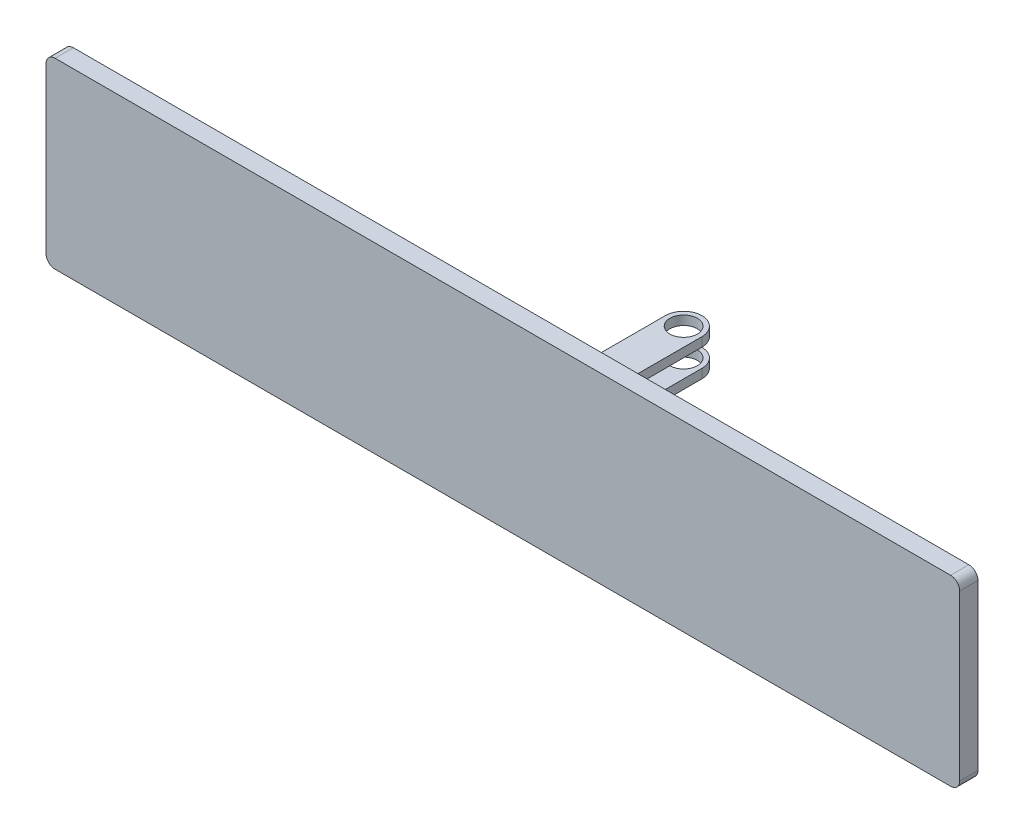
ISO-10303-21;
HEADER;
FILE_DESCRIPTION(('STEP AP214'),'2;1');
FILE_NAME('part.step','',(''),(''),'','','');
FILE_SCHEMA(('AUTOMOTIVE_DESIGN { 1 0 10303 214 1 1 1 1 }'));
ENDSEC;
DATA;
#1=APPLICATION_CONTEXT('core data for automotive mechanical design processes');
#2=APPLICATION_PROTOCOL_DEFINITION('international standard','automotive_design',2000,#1);
#3=PRODUCT_CONTEXT('',#1,'mechanical');
#4=PRODUCT('Part','Part','',(#3));
#5=PRODUCT_RELATED_PRODUCT_CATEGORY('part','',(#4));
#6=PRODUCT_DEFINITION_FORMATION('','',#4);
#7=PRODUCT_DEFINITION_CONTEXT('part definition',#1,'design');
#8=PRODUCT_DEFINITION('design','',#6,#7);
#9=PRODUCT_DEFINITION_SHAPE('','',#8);
#10=(LENGTH_UNIT() NAMED_UNIT(*) SI_UNIT(.MILLI.,.METRE.));
#11=(NAMED_UNIT(*) PLANE_ANGLE_UNIT() SI_UNIT($,.RADIAN.));
#12=(NAMED_UNIT(*) SI_UNIT($,.STERADIAN.) SOLID_ANGLE_UNIT());
#13=UNCERTAINTY_MEASURE_WITH_UNIT(LENGTH_MEASURE(1.E-05),#10,'distance_accuracy_value','');
#14=(GEOMETRIC_REPRESENTATION_CONTEXT(3) GLOBAL_UNCERTAINTY_ASSIGNED_CONTEXT((#13)) GLOBAL_UNIT_ASSIGNED_CONTEXT((#10,
#11,#12)) REPRESENTATION_CONTEXT('',''));
#15=CARTESIAN_POINT('',(0.,0.,0.));
#16=DIRECTION('',(0.,0.,1.));
#17=DIRECTION('',(1.,0.,0.));
#18=AXIS2_PLACEMENT_3D('',#15,#16,#17);
#19=CARTESIAN_POINT('',(0.,0.,0.));
#20=DIRECTION('',(0.,0.,1.));
#21=DIRECTION('',(1.,0.,0.));
#22=AXIS2_PLACEMENT_3D('',#19,#20,#21);
#23=PLANE('',#22);
#24=DIRECTION('',(0.,-1.,0.));
#25=VECTOR('',#24,1.);
#26=CARTESIAN_POINT('',(9.73097674118233,-4.24877108959848,0.));
#27=LINE('',#26,#25);
#28=CARTESIAN_POINT('',(9.73097674118233,-4.24877108959848,0.));
#29=VERTEX_POINT('',#28);
#30=CARTESIAN_POINT('',(9.73097674118233,-5.24877108959848,0.));
#31=VERTEX_POINT('',#30);
#32=EDGE_CURVE('E57',#29,#31,#27,.T.);
#33=ORIENTED_EDGE('',*,*,#32,.F.);
#34=DIRECTION('',(1.,0.,0.));
#35=VECTOR('',#34,1.);
#36=CARTESIAN_POINT('',(5.73097674118233,-4.24877108959848,0.));
#37=LINE('',#36,#35);
#38=CARTESIAN_POINT('',(5.73097674118233,-4.24877108959848,0.));
#39=VERTEX_POINT('',#38);
#40=EDGE_CURVE('E62',#39,#29,#37,.T.);
#41=ORIENTED_EDGE('',*,*,#40,.F.);
#42=DIRECTION('',(0.,-1.,0.));
#43=VECTOR('',#42,1.);
#44=CARTESIAN_POINT('',(5.73097674118233,-4.24877108959848,0.));
#45=LINE('',#44,#43);
#46=CARTESIAN_POINT('',(5.73097674118233,-5.24877108959848,0.));
#47=VERTEX_POINT('',#46);
#48=EDGE_CURVE('E178',#39,#47,#45,.T.);
#49=ORIENTED_EDGE('',*,*,#48,.T.);
#50=DIRECTION('',(1.,0.,0.));
#51=VECTOR('',#50,1.);
#52=CARTESIAN_POINT('',(5.73097674118233,-5.24877108959848,0.));
#53=LINE('',#52,#51);
#54=EDGE_CURVE('E182',#47,#31,#53,.T.);
#55=ORIENTED_EDGE('',*,*,#54,.T.);
#56=EDGE_LOOP('',(#33,#41,#49,#55));
#57=FACE_BOUND('',#56,.T.);
#58=DIRECTION('',(1.,0.,0.));
#59=VECTOR('',#58,1.);
#60=CARTESIAN_POINT('',(-45.0489881106832,3.75122891040152,0.));
#61=LINE('',#60,#59);
#62=CARTESIAN_POINT('',(-44.0489881106832,3.75122891040152,0.));
#63=VERTEX_POINT('',#62);
#64=CARTESIAN_POINT('',(53.9510118893168,3.75122891040152,0.));
#65=VERTEX_POINT('',#64);
#66=EDGE_CURVE('E250',#63,#65,#61,.T.);
#67=ORIENTED_EDGE('',*,*,#66,.T.);
#68=CARTESIAN_POINT('',(53.9510118893168,2.75122891040152,0.));
#69=DIRECTION('',(0.,0.,1.));
#70=DIRECTION('',(1.,0.,0.));
#71=AXIS2_PLACEMENT_3D('',#68,#69,#70);
#72=CIRCLE('',#71,1.);
#73=CARTESIAN_POINT('',(54.9510118893168,2.75122891040152,0.));
#74=VERTEX_POINT('',#73);
#75=EDGE_CURVE('E11',#65,#74,#72,.F.);
#76=ORIENTED_EDGE('',*,*,#75,.T.);
#77=DIRECTION('',(0.,-1.,0.));
#78=VECTOR('',#77,1.);
#79=CARTESIAN_POINT('',(54.9510118893168,3.75122891040152,0.));
#80=LINE('',#79,#78);
#81=CARTESIAN_POINT('',(54.9510118893168,-15.2487710895985,0.));
#82=VERTEX_POINT('',#81);
#83=EDGE_CURVE('E266',#74,#82,#80,.T.);
#84=ORIENTED_EDGE('',*,*,#83,.T.);
#85=CARTESIAN_POINT('',(53.9510118893168,-15.2487710895985,0.));
#86=DIRECTION('',(0.,0.,1.));
#87=DIRECTION('',(1.,0.,0.));
#88=AXIS2_PLACEMENT_3D('',#85,#86,#87);
#89=CIRCLE('',#88,1.);
#90=CARTESIAN_POINT('',(53.9510118893168,-16.2487710895985,0.));
#91=VERTEX_POINT('',#90);
#92=EDGE_CURVE('E283',#82,#91,#89,.F.);
#93=ORIENTED_EDGE('',*,*,#92,.T.);
#94=DIRECTION('',(1.,0.,0.));
#95=VECTOR('',#94,1.);
#96=CARTESIAN_POINT('',(-45.0489881106832,-16.2487710895985,0.));
#97=LINE('',#96,#95);
#98=CARTESIAN_POINT('',(-44.0489881106832,-16.2487710895985,0.));
#99=VERTEX_POINT('',#98);
#100=EDGE_CURVE('E263',#99,#91,#97,.T.);
#101=ORIENTED_EDGE('',*,*,#100,.F.);
#102=CARTESIAN_POINT('',(-44.0489881106832,-15.2487710895985,0.));
#103=DIRECTION('',(0.,0.,1.));
#104=DIRECTION('',(1.,0.,0.));
#105=AXIS2_PLACEMENT_3D('',#102,#103,#104);
#106=CIRCLE('',#105,1.);
#107=CARTESIAN_POINT('',(-45.0489881106832,-15.2487710895985,0.));
#108=VERTEX_POINT('',#107);
#109=EDGE_CURVE('E295',#99,#108,#106,.F.);
#110=ORIENTED_EDGE('',*,*,#109,.T.);
#111=DIRECTION('',(0.,-1.,0.));
#112=VECTOR('',#111,1.);
#113=CARTESIAN_POINT('',(-45.0489881106832,3.75122891040152,0.));
#114=LINE('',#113,#112);
#115=CARTESIAN_POINT('',(-45.0489881106832,2.75122891040152,0.));
#116=VERTEX_POINT('',#115);
#117=EDGE_CURVE('E245',#116,#108,#114,.T.);
#118=ORIENTED_EDGE('',*,*,#117,.F.);
#119=CARTESIAN_POINT('',(-44.0489881106832,2.75122891040152,0.));
#120=DIRECTION('',(0.,0.,1.));
#121=DIRECTION('',(1.,0.,0.));
#122=AXIS2_PLACEMENT_3D('',#119,#120,#121);
#123=CIRCLE('',#122,1.);
#124=EDGE_CURVE('E310',#116,#63,#123,.F.);
#125=ORIENTED_EDGE('',*,*,#124,.T.);
#126=EDGE_LOOP('',(#67,#76,#84,#93,#101,#110,#118,#125));
#127=FACE_BOUND('',#126,.T.);
#128=DIRECTION('',(-1.,0.,0.));
#129=VECTOR('',#128,1.);
#130=CARTESIAN_POINT('',(9.73097674118233,-8.24877108959848,0.));
#131=LINE('',#130,#129);
#132=CARTESIAN_POINT('',(9.73097674118233,-8.24877108959848,0.));
#133=VERTEX_POINT('',#132);
#134=CARTESIAN_POINT('',(5.73097674118233,-8.24877108959848,0.));
#135=VERTEX_POINT('',#134);
#136=EDGE_CURVE('E202',#133,#135,#131,.T.);
#137=ORIENTED_EDGE('',*,*,#136,.F.);
#138=DIRECTION('',(0.,1.,0.));
#139=VECTOR('',#138,1.);
#140=CARTESIAN_POINT('',(9.73097674118233,-8.24877108959848,0.));
#141=LINE('',#140,#139);
#142=CARTESIAN_POINT('',(9.73097674118233,-7.24877108959848,0.));
#143=VERTEX_POINT('',#142);
#144=EDGE_CURVE('E218',#133,#143,#141,.T.);
#145=ORIENTED_EDGE('',*,*,#144,.T.);
#146=DIRECTION('',(-1.,0.,0.));
#147=VECTOR('',#146,1.);
#148=CARTESIAN_POINT('',(9.73097674118233,-7.24877108959848,0.));
#149=LINE('',#148,#147);
#150=CARTESIAN_POINT('',(5.73097674118233,-7.24877108959848,0.));
#151=VERTEX_POINT('',#150);
#152=EDGE_CURVE('E201',#143,#151,#149,.T.);
#153=ORIENTED_EDGE('',*,*,#152,.T.);
#154=DIRECTION('',(0.,1.,0.));
#155=VECTOR('',#154,1.);
#156=CARTESIAN_POINT('',(5.73097674118233,-8.24877108959848,0.));
#157=LINE('',#156,#155);
#158=EDGE_CURVE('E242',#135,#151,#157,.T.);
#159=ORIENTED_EDGE('',*,*,#158,.F.);
#160=EDGE_LOOP('',(#137,#145,#153,#159));
#161=FACE_BOUND('',#160,.T.);
#162=ADVANCED_FACE('F39',(#57,#127,#161),#23,.F.);
#163=CARTESIAN_POINT('',(53.9510118893168,2.75122891040152,2.));
#164=DIRECTION('',(0.,0.,-1.));
#165=DIRECTION('',(-1.,0.,0.));
#166=AXIS2_PLACEMENT_3D('',#163,#164,#165);
#167=CYLINDRICAL_SURFACE('',#166,1.);
#168=DIRECTION('',(0.,0.,-1.));
#169=VECTOR('',#168,1.);
#170=CARTESIAN_POINT('',(53.9510118893168,3.75122891040152,2.));
#171=LINE('',#170,#169);
#172=CARTESIAN_POINT('',(53.9510118893168,3.75122891040152,2.));
#173=VERTEX_POINT('',#172);
#174=EDGE_CURVE('E316',#173,#65,#171,.T.);
#175=ORIENTED_EDGE('',*,*,#174,.F.);
#176=CARTESIAN_POINT('',(53.9510118893168,2.75122891040152,2.));
#177=DIRECTION('',(0.,0.,1.));
#178=DIRECTION('',(1.,0.,0.));
#179=AXIS2_PLACEMENT_3D('',#176,#177,#178);
#180=CIRCLE('',#179,1.);
#181=CARTESIAN_POINT('',(54.9510118893168,2.75122891040152,2.));
#182=VERTEX_POINT('',#181);
#183=EDGE_CURVE('E49',#182,#173,#180,.T.);
#184=ORIENTED_EDGE('',*,*,#183,.F.);
#185=DIRECTION('',(0.,0.,-1.));
#186=VECTOR('',#185,1.);
#187=CARTESIAN_POINT('',(54.9510118893168,2.75122891040152,2.));
#188=LINE('',#187,#186);
#189=EDGE_CURVE('E320',#74,#182,#188,.F.);
#190=ORIENTED_EDGE('',*,*,#189,.F.);
#191=ORIENTED_EDGE('',*,*,#75,.F.);
#192=EDGE_LOOP('',(#175,#184,#190,#191));
#193=FACE_BOUND('',#192,.T.);
#194=ADVANCED_FACE('F41',(#193),#167,.T.);
#195=CARTESIAN_POINT('',(-44.0489881106832,2.75122891040152,2.));
#196=DIRECTION('',(0.,0.,-1.));
#197=DIRECTION('',(-1.,0.,0.));
#198=AXIS2_PLACEMENT_3D('',#195,#196,#197);
#199=CYLINDRICAL_SURFACE('',#198,1.);
#200=DIRECTION('',(0.,0.,1.));
#201=VECTOR('',#200,1.);
#202=CARTESIAN_POINT('',(-44.0489881106832,3.75122891040152,2.));
#203=LINE('',#202,#201);
#204=CARTESIAN_POINT('',(-44.0489881106832,3.75122891040152,2.));
#205=VERTEX_POINT('',#204);
#206=EDGE_CURVE('E302',#63,#205,#203,.T.);
#207=ORIENTED_EDGE('',*,*,#206,.F.);
#208=ORIENTED_EDGE('',*,*,#124,.F.);
#209=DIRECTION('',(0.,0.,1.));
#210=VECTOR('',#209,1.);
#211=CARTESIAN_POINT('',(-45.0489881106832,2.75122891040152,2.));
#212=LINE('',#211,#210);
#213=CARTESIAN_POINT('',(-45.0489881106832,2.75122891040152,2.));
#214=VERTEX_POINT('',#213);
#215=EDGE_CURVE('E306',#214,#116,#212,.F.);
#216=ORIENTED_EDGE('',*,*,#215,.F.);
#217=CARTESIAN_POINT('',(-44.0489881106832,2.75122891040152,2.));
#218=DIRECTION('',(0.,0.,1.));
#219=DIRECTION('',(1.,0.,0.));
#220=AXIS2_PLACEMENT_3D('',#217,#218,#219);
#221=CIRCLE('',#220,1.);
#222=EDGE_CURVE('E313',#205,#214,#221,.T.);
#223=ORIENTED_EDGE('',*,*,#222,.F.);
#224=EDGE_LOOP('',(#207,#208,#216,#223));
#225=FACE_BOUND('',#224,.T.);
#226=ADVANCED_FACE('F382',(#225),#199,.T.);
#227=CARTESIAN_POINT('',(-44.0489881106832,-15.2487710895985,2.));
#228=DIRECTION('',(0.,0.,1.));
#229=DIRECTION('',(1.,0.,0.));
#230=AXIS2_PLACEMENT_3D('',#227,#228,#229);
#231=CYLINDRICAL_SURFACE('',#230,1.);
#232=DIRECTION('',(0.,0.,1.));
#233=VECTOR('',#232,1.);
#234=CARTESIAN_POINT('',(-45.0489881106832,-15.2487710895985,2.));
#235=LINE('',#234,#233);
#236=CARTESIAN_POINT('',(-45.0489881106832,-15.2487710895985,2.));
#237=VERTEX_POINT('',#236);
#238=EDGE_CURVE('E287',#108,#237,#235,.T.);
#239=ORIENTED_EDGE('',*,*,#238,.F.);
#240=ORIENTED_EDGE('',*,*,#109,.F.);
#241=DIRECTION('',(0.,0.,1.));
#242=VECTOR('',#241,1.);
#243=CARTESIAN_POINT('',(-44.0489881106832,-16.2487710895985,2.));
#244=LINE('',#243,#242);
#245=CARTESIAN_POINT('',(-44.0489881106832,-16.2487710895985,2.));
#246=VERTEX_POINT('',#245);
#247=EDGE_CURVE('E291',#246,#99,#244,.F.);
#248=ORIENTED_EDGE('',*,*,#247,.F.);
#249=CARTESIAN_POINT('',(-44.0489881106832,-15.2487710895985,2.));
#250=DIRECTION('',(0.,0.,1.));
#251=DIRECTION('',(1.,0.,0.));
#252=AXIS2_PLACEMENT_3D('',#249,#250,#251);
#253=CIRCLE('',#252,1.);
#254=EDGE_CURVE('E299',#237,#246,#253,.T.);
#255=ORIENTED_EDGE('',*,*,#254,.F.);
#256=EDGE_LOOP('',(#239,#240,#248,#255));
#257=FACE_BOUND('',#256,.T.);
#258=ADVANCED_FACE('F408',(#257),#231,.T.);
#259=CARTESIAN_POINT('',(53.9510118893168,-15.2487710895985,2.));
#260=DIRECTION('',(0.,0.,1.));
#261=DIRECTION('',(1.,0.,0.));
#262=AXIS2_PLACEMENT_3D('',#259,#260,#261);
#263=CYLINDRICAL_SURFACE('',#262,1.);
#264=DIRECTION('',(0.,0.,-1.));
#265=VECTOR('',#264,1.);
#266=CARTESIAN_POINT('',(54.9510118893168,-15.2487710895985,2.));
#267=LINE('',#266,#265);
#268=CARTESIAN_POINT('',(54.9510118893168,-15.2487710895985,2.));
#269=VERTEX_POINT('',#268);
#270=EDGE_CURVE('E260',#269,#82,#267,.T.);
#271=ORIENTED_EDGE('',*,*,#270,.F.);
#272=CARTESIAN_POINT('',(53.9510118893168,-15.2487710895985,2.));
#273=DIRECTION('',(0.,0.,1.));
#274=DIRECTION('',(1.,0.,0.));
#275=AXIS2_PLACEMENT_3D('',#272,#273,#274);
#276=CIRCLE('',#275,1.);
#277=CARTESIAN_POINT('',(53.9510118893168,-16.2487710895985,2.));
#278=VERTEX_POINT('',#277);
#279=EDGE_CURVE('E279',#278,#269,#276,.T.);
#280=ORIENTED_EDGE('',*,*,#279,.F.);
#281=DIRECTION('',(0.,0.,-1.));
#282=VECTOR('',#281,1.);
#283=CARTESIAN_POINT('',(53.9510118893168,-16.2487710895985,2.));
#284=LINE('',#283,#282);
#285=EDGE_CURVE('E275',#91,#278,#284,.F.);
#286=ORIENTED_EDGE('',*,*,#285,.F.);
#287=ORIENTED_EDGE('',*,*,#92,.F.);
#288=EDGE_LOOP('',(#271,#280,#286,#287));
#289=FACE_BOUND('',#288,.T.);
#290=ADVANCED_FACE('F404',(#289),#263,.T.);
#291=CARTESIAN_POINT('',(-45.0489881106832,3.75122891040152,2.));
#292=DIRECTION('',(1.,0.,0.));
#293=DIRECTION('',(0.,0.,-1.));
#294=AXIS2_PLACEMENT_3D('',#291,#292,#293);
#295=PLANE('',#294);
#296=DIRECTION('',(0.,-1.,0.));
#297=VECTOR('',#296,1.);
#298=CARTESIAN_POINT('',(-45.0489881106832,3.75122891040152,2.));
#299=LINE('',#298,#297);
#300=EDGE_CURVE('E246',#214,#237,#299,.T.);
#301=ORIENTED_EDGE('',*,*,#300,.F.);
#302=ORIENTED_EDGE('',*,*,#215,.T.);
#303=ORIENTED_EDGE('',*,*,#117,.T.);
#304=ORIENTED_EDGE('',*,*,#238,.T.);
#305=EDGE_LOOP('',(#301,#302,#303,#304));
#306=FACE_BOUND('',#305,.T.);
#307=ADVANCED_FACE('F400',(#306),#295,.F.);
#308=CARTESIAN_POINT('',(-45.0489881106832,-16.2487710895985,2.));
#309=DIRECTION('',(0.,1.,0.));
#310=DIRECTION('',(0.,0.,1.));
#311=AXIS2_PLACEMENT_3D('',#308,#309,#310);
#312=PLANE('',#311);
#313=DIRECTION('',(1.,0.,0.));
#314=VECTOR('',#313,1.);
#315=CARTESIAN_POINT('',(-45.0489881106832,-16.2487710895985,2.));
#316=LINE('',#315,#314);
#317=EDGE_CURVE('E249',#246,#278,#316,.T.);
#318=ORIENTED_EDGE('',*,*,#317,.F.);
#319=ORIENTED_EDGE('',*,*,#247,.T.);
#320=ORIENTED_EDGE('',*,*,#100,.T.);
#321=ORIENTED_EDGE('',*,*,#285,.T.);
#322=EDGE_LOOP('',(#318,#319,#320,#321));
#323=FACE_BOUND('',#322,.T.);
#324=ADVANCED_FACE('F396',(#323),#312,.F.);
#325=CARTESIAN_POINT('',(54.9510118893168,3.75122891040152,2.));
#326=DIRECTION('',(1.,0.,0.));
#327=DIRECTION('',(0.,0.,-1.));
#328=AXIS2_PLACEMENT_3D('',#325,#326,#327);
#329=PLANE('',#328);
#330=ORIENTED_EDGE('',*,*,#83,.F.);
#331=ORIENTED_EDGE('',*,*,#189,.T.);
#332=DIRECTION('',(0.,-1.,0.));
#333=VECTOR('',#332,1.);
#334=CARTESIAN_POINT('',(54.9510118893168,3.75122891040152,2.));
#335=LINE('',#334,#333);
#336=EDGE_CURVE('E253',#182,#269,#335,.T.);
#337=ORIENTED_EDGE('',*,*,#336,.T.);
#338=ORIENTED_EDGE('',*,*,#270,.T.);
#339=EDGE_LOOP('',(#330,#331,#337,#338));
#340=FACE_BOUND('',#339,.T.);
#341=ADVANCED_FACE('F392',(#340),#329,.T.);
#342=CARTESIAN_POINT('',(-45.0489881106832,3.75122891040152,2.));
#343=DIRECTION('',(0.,1.,0.));
#344=DIRECTION('',(0.,0.,1.));
#345=AXIS2_PLACEMENT_3D('',#342,#343,#344);
#346=PLANE('',#345);
#347=DIRECTION('',(1.,0.,0.));
#348=VECTOR('',#347,1.);
#349=CARTESIAN_POINT('',(-45.0489881106832,3.75122891040152,2.));
#350=LINE('',#349,#348);
#351=EDGE_CURVE('E256',#205,#173,#350,.T.);
#352=ORIENTED_EDGE('',*,*,#351,.T.);
#353=ORIENTED_EDGE('',*,*,#174,.T.);
#354=ORIENTED_EDGE('',*,*,#66,.F.);
#355=ORIENTED_EDGE('',*,*,#206,.T.);
#356=EDGE_LOOP('',(#352,#353,#354,#355));
#357=FACE_BOUND('',#356,.T.);
#358=ADVANCED_FACE('F389',(#357),#346,.T.);
#359=CARTESIAN_POINT('',(0.,0.,2.));
#360=DIRECTION('',(0.,0.,1.));
#361=DIRECTION('',(1.,0.,0.));
#362=AXIS2_PLACEMENT_3D('',#359,#360,#361);
#363=PLANE('',#362);
#364=ORIENTED_EDGE('',*,*,#336,.F.);
#365=ORIENTED_EDGE('',*,*,#183,.T.);
#366=ORIENTED_EDGE('',*,*,#351,.F.);
#367=ORIENTED_EDGE('',*,*,#222,.T.);
#368=ORIENTED_EDGE('',*,*,#300,.T.);
#369=ORIENTED_EDGE('',*,*,#254,.T.);
#370=ORIENTED_EDGE('',*,*,#317,.T.);
#371=ORIENTED_EDGE('',*,*,#279,.T.);
#372=EDGE_LOOP('',(#364,#365,#366,#367,#368,#369,#370,#371));
#373=FACE_BOUND('',#372,.T.);
#374=ADVANCED_FACE('F387',(#373),#363,.T.);
#375=CARTESIAN_POINT('',(5.73097674118233,-8.24877108959848,0.));
#376=DIRECTION('',(1.,0.,0.));
#377=DIRECTION('',(0.,0.,-1.));
#378=AXIS2_PLACEMENT_3D('',#375,#376,#377);
#379=PLANE('',#378);
#380=DIRECTION('',(0.,0.,-1.));
#381=VECTOR('',#380,1.);
#382=CARTESIAN_POINT('',(5.73097674118233,-7.24877108959848,0.));
#383=LINE('',#382,#381);
#384=CARTESIAN_POINT('',(5.73097674118233,-7.24877108959848,-15.));
#385=VERTEX_POINT('',#384);
#386=EDGE_CURVE('E222',#151,#385,#383,.T.);
#387=ORIENTED_EDGE('',*,*,#386,.T.);
#388=DIRECTION('',(0.,1.,0.));
#389=VECTOR('',#388,1.);
#390=CARTESIAN_POINT('',(5.73097674118233,-8.24877108959848,-15.));
#391=LINE('',#390,#389);
#392=CARTESIAN_POINT('',(5.73097674118233,-8.24877108959848,-15.));
#393=VERTEX_POINT('',#392);
#394=EDGE_CURVE('E239',#393,#385,#391,.T.);
#395=ORIENTED_EDGE('',*,*,#394,.F.);
#396=DIRECTION('',(0.,0.,-1.));
#397=VECTOR('',#396,1.);
#398=CARTESIAN_POINT('',(5.73097674118233,-8.24877108959848,0.));
#399=LINE('',#398,#397);
#400=EDGE_CURVE('E206',#135,#393,#399,.T.);
#401=ORIENTED_EDGE('',*,*,#400,.F.);
#402=ORIENTED_EDGE('',*,*,#158,.T.);
#403=EDGE_LOOP('',(#387,#395,#401,#402));
#404=FACE_BOUND('',#403,.T.);
#405=ADVANCED_FACE('F438',(#404),#379,.F.);
#406=CARTESIAN_POINT('',(7.73097674118233,-8.24877108959848,-15.));
#407=DIRECTION('',(0.,1.,0.));
#408=DIRECTION('',(0.,0.,1.));
#409=AXIS2_PLACEMENT_3D('',#406,#407,#408);
#410=CYLINDRICAL_SURFACE('',#409,2.);
#411=CARTESIAN_POINT('',(7.73097674118233,-7.24877108959848,-15.));
#412=DIRECTION('',(0.,1.,0.));
#413=DIRECTION('',(0.,0.,1.));
#414=AXIS2_PLACEMENT_3D('',#411,#412,#413);
#415=CIRCLE('',#414,2.);
#416=CARTESIAN_POINT('',(9.73097674118233,-7.24877108959848,-15.));
#417=VERTEX_POINT('',#416);
#418=EDGE_CURVE('E226',#417,#385,#415,.T.);
#419=ORIENTED_EDGE('',*,*,#418,.F.);
#420=DIRECTION('',(0.,1.,0.));
#421=VECTOR('',#420,1.);
#422=CARTESIAN_POINT('',(9.73097674118233,-8.24877108959848,-15.));
#423=LINE('',#422,#421);
#424=CARTESIAN_POINT('',(9.73097674118233,-8.24877108959848,-15.));
#425=VERTEX_POINT('',#424);
#426=EDGE_CURVE('E236',#425,#417,#423,.T.);
#427=ORIENTED_EDGE('',*,*,#426,.F.);
#428=CARTESIAN_POINT('',(7.73097674118233,-8.24877108959848,-15.));
#429=DIRECTION('',(0.,1.,0.));
#430=DIRECTION('',(0.,0.,1.));
#431=AXIS2_PLACEMENT_3D('',#428,#429,#430);
#432=CIRCLE('',#431,2.);
#433=EDGE_CURVE('E210',#425,#393,#432,.T.);
#434=ORIENTED_EDGE('',*,*,#433,.T.);
#435=ORIENTED_EDGE('',*,*,#394,.T.);
#436=EDGE_LOOP('',(#419,#427,#434,#435));
#437=FACE_BOUND('',#436,.T.);
#438=ADVANCED_FACE('F442',(#437),#410,.T.);
#439=CARTESIAN_POINT('',(9.73097674118233,-8.24877108959848,0.));
#440=DIRECTION('',(1.,0.,0.));
#441=DIRECTION('',(0.,0.,-1.));
#442=AXIS2_PLACEMENT_3D('',#439,#440,#441);
#443=PLANE('',#442);
#444=DIRECTION('',(0.,0.,-1.));
#445=VECTOR('',#444,1.);
#446=CARTESIAN_POINT('',(9.73097674118233,-7.24877108959848,0.));
#447=LINE('',#446,#445);
#448=EDGE_CURVE('E207',#143,#417,#447,.T.);
#449=ORIENTED_EDGE('',*,*,#448,.F.);
#450=ORIENTED_EDGE('',*,*,#144,.F.);
#451=DIRECTION('',(0.,0.,-1.));
#452=VECTOR('',#451,1.);
#453=CARTESIAN_POINT('',(9.73097674118233,-8.24877108959848,0.));
#454=LINE('',#453,#452);
#455=EDGE_CURVE('E214',#133,#425,#454,.T.);
#456=ORIENTED_EDGE('',*,*,#455,.T.);
#457=ORIENTED_EDGE('',*,*,#426,.T.);
#458=EDGE_LOOP('',(#449,#450,#456,#457));
#459=FACE_BOUND('',#458,.T.);
#460=ADVANCED_FACE('F447',(#459),#443,.T.);
#461=CARTESIAN_POINT('',(7.73097674118233,-8.24877108959848,-15.));
#462=DIRECTION('',(0.,1.,0.));
#463=DIRECTION('',(0.,0.,1.));
#464=AXIS2_PLACEMENT_3D('',#461,#462,#463);
#465=PLANE('',#464);
#466=CARTESIAN_POINT('',(7.73097674118233,-8.24877108959848,-15.));
#467=DIRECTION('',(0.,1.,0.));
#468=DIRECTION('',(0.,0.,1.));
#469=AXIS2_PLACEMENT_3D('',#466,#467,#468);
#470=CIRCLE('',#469,1.5);
#471=CARTESIAN_POINT('',(7.73097674118233,-8.24877108959848,-13.5));
#472=VERTEX_POINT('',#471);
#473=EDGE_CURVE('E185',#472,#472,#470,.T.);
#474=ORIENTED_EDGE('',*,*,#473,.T.);
#475=EDGE_LOOP('',(#474));
#476=FACE_BOUND('',#475,.T.);
#477=CARTESIAN_POINT('',(7.73097674118233,-8.24877108959848,-5.));
#478=DIRECTION('',(0.,1.,0.));
#479=DIRECTION('',(0.,0.,1.));
#480=AXIS2_PLACEMENT_3D('',#477,#478,#479);
#481=CIRCLE('',#480,1.5);
#482=CARTESIAN_POINT('',(7.73097674118233,-8.24877108959848,-3.5));
#483=VERTEX_POINT('',#482);
#484=EDGE_CURVE('E335',#483,#483,#481,.T.);
#485=ORIENTED_EDGE('',*,*,#484,.T.);
#486=EDGE_LOOP('',(#485));
#487=FACE_BOUND('',#486,.T.);
#488=ORIENTED_EDGE('',*,*,#136,.T.);
#489=ORIENTED_EDGE('',*,*,#400,.T.);
#490=ORIENTED_EDGE('',*,*,#433,.F.);
#491=ORIENTED_EDGE('',*,*,#455,.F.);
#492=EDGE_LOOP('',(#488,#489,#490,#491));
#493=FACE_BOUND('',#492,.T.);
#494=ADVANCED_FACE('F453',(#476,#487,#493),#465,.F.);
#495=CARTESIAN_POINT('',(7.73097674118233,-7.24877108959848,-15.));
#496=DIRECTION('',(0.,1.,0.));
#497=DIRECTION('',(0.,0.,1.));
#498=AXIS2_PLACEMENT_3D('',#495,#496,#497);
#499=PLANE('',#498);
#500=CARTESIAN_POINT('',(7.73097674118233,-7.24877108959848,-15.));
#501=DIRECTION('',(0.,1.,0.));
#502=DIRECTION('',(0.,0.,1.));
#503=AXIS2_PLACEMENT_3D('',#500,#501,#502);
#504=CIRCLE('',#503,1.5);
#505=CARTESIAN_POINT('',(7.73097674118233,-7.24877108959848,-13.5));
#506=VERTEX_POINT('',#505);
#507=EDGE_CURVE('E349',#506,#506,#504,.T.);
#508=ORIENTED_EDGE('',*,*,#507,.F.);
#509=EDGE_LOOP('',(#508));
#510=FACE_BOUND('',#509,.T.);
#511=CARTESIAN_POINT('',(7.73097674118233,-7.24877108959848,-5.));
#512=DIRECTION('',(0.,1.,0.));
#513=DIRECTION('',(0.,0.,1.));
#514=AXIS2_PLACEMENT_3D('',#511,#512,#513);
#515=CIRCLE('',#514,1.5);
#516=CARTESIAN_POINT('',(7.73097674118233,-7.24877108959848,-3.5));
#517=VERTEX_POINT('',#516);
#518=EDGE_CURVE('E328',#517,#517,#515,.T.);
#519=ORIENTED_EDGE('',*,*,#518,.F.);
#520=EDGE_LOOP('',(#519));
#521=FACE_BOUND('',#520,.T.);
#522=ORIENTED_EDGE('',*,*,#152,.F.);
#523=ORIENTED_EDGE('',*,*,#448,.T.);
#524=ORIENTED_EDGE('',*,*,#418,.T.);
#525=ORIENTED_EDGE('',*,*,#386,.F.);
#526=EDGE_LOOP('',(#522,#523,#524,#525));
#527=FACE_BOUND('',#526,.T.);
#528=ADVANCED_FACE('F455',(#510,#521,#527),#499,.T.);
#529=CARTESIAN_POINT('',(9.73097674118233,-4.24877108959848,0.));
#530=DIRECTION('',(-1.,0.,0.));
#531=DIRECTION('',(0.,0.,1.));
#532=AXIS2_PLACEMENT_3D('',#529,#530,#531);
#533=PLANE('',#532);
#534=DIRECTION('',(0.,0.,-1.));
#535=VECTOR('',#534,1.);
#536=CARTESIAN_POINT('',(9.73097674118233,-5.24877108959848,0.));
#537=LINE('',#536,#535);
#538=CARTESIAN_POINT('',(9.73097674118233,-5.24877108959848,-15.));
#539=VERTEX_POINT('',#538);
#540=EDGE_CURVE('E165',#31,#539,#537,.T.);
#541=ORIENTED_EDGE('',*,*,#540,.T.);
#542=DIRECTION('',(0.,-1.,0.));
#543=VECTOR('',#542,1.);
#544=CARTESIAN_POINT('',(9.73097674118233,-4.24877108959848,-15.));
#545=LINE('',#544,#543);
#546=CARTESIAN_POINT('',(9.73097674118233,-4.24877108959848,-15.));
#547=VERTEX_POINT('',#546);
#548=EDGE_CURVE('E162',#547,#539,#545,.T.);
#549=ORIENTED_EDGE('',*,*,#548,.F.);
#550=DIRECTION('',(0.,0.,-1.));
#551=VECTOR('',#550,1.);
#552=CARTESIAN_POINT('',(9.73097674118233,-4.24877108959848,0.));
#553=LINE('',#552,#551);
#554=EDGE_CURVE('E151',#29,#547,#553,.T.);
#555=ORIENTED_EDGE('',*,*,#554,.F.);
#556=ORIENTED_EDGE('',*,*,#32,.T.);
#557=EDGE_LOOP('',(#541,#549,#555,#556));
#558=FACE_BOUND('',#557,.T.);
#559=ADVANCED_FACE('F163',(#558),#533,.F.);
#560=CARTESIAN_POINT('',(7.73097674118233,-4.24877108959848,-15.));
#561=DIRECTION('',(0.,-1.,0.));
#562=DIRECTION('',(0.,0.,-1.));
#563=AXIS2_PLACEMENT_3D('',#560,#561,#562);
#564=CYLINDRICAL_SURFACE('',#563,2.);
#565=CARTESIAN_POINT('',(7.73097674118233,-5.24877108959848,-15.));
#566=DIRECTION('',(0.,1.,0.));
#567=DIRECTION('',(0.,0.,1.));
#568=AXIS2_PLACEMENT_3D('',#565,#566,#567);
#569=CIRCLE('',#568,2.);
#570=CARTESIAN_POINT('',(5.73097674118233,-5.24877108959848,-15.));
#571=VERTEX_POINT('',#570);
#572=EDGE_CURVE('E188',#539,#571,#569,.T.);
#573=ORIENTED_EDGE('',*,*,#572,.T.);
#574=DIRECTION('',(0.,-1.,0.));
#575=VECTOR('',#574,1.);
#576=CARTESIAN_POINT('',(5.73097674118233,-4.24877108959848,-15.));
#577=LINE('',#576,#575);
#578=CARTESIAN_POINT('',(5.73097674118233,-4.24877108959848,-15.));
#579=VERTEX_POINT('',#578);
#580=EDGE_CURVE('E170',#579,#571,#577,.T.);
#581=ORIENTED_EDGE('',*,*,#580,.F.);
#582=CARTESIAN_POINT('',(7.73097674118233,-4.24877108959848,-15.));
#583=DIRECTION('',(0.,1.,0.));
#584=DIRECTION('',(0.,0.,1.));
#585=AXIS2_PLACEMENT_3D('',#582,#583,#584);
#586=CIRCLE('',#585,2.);
#587=EDGE_CURVE('E156',#547,#579,#586,.T.);
#588=ORIENTED_EDGE('',*,*,#587,.F.);
#589=ORIENTED_EDGE('',*,*,#548,.T.);
#590=EDGE_LOOP('',(#573,#581,#588,#589));
#591=FACE_BOUND('',#590,.T.);
#592=ADVANCED_FACE('F172',(#591),#564,.T.);
#593=CARTESIAN_POINT('',(5.73097674118233,-4.24877108959848,0.));
#594=DIRECTION('',(-1.,0.,0.));
#595=DIRECTION('',(0.,0.,1.));
#596=AXIS2_PLACEMENT_3D('',#593,#594,#595);
#597=PLANE('',#596);
#598=DIRECTION('',(0.,0.,-1.));
#599=VECTOR('',#598,1.);
#600=CARTESIAN_POINT('',(5.73097674118233,-5.24877108959848,0.));
#601=LINE('',#600,#599);
#602=EDGE_CURVE('E191',#47,#571,#601,.T.);
#603=ORIENTED_EDGE('',*,*,#602,.F.);
#604=ORIENTED_EDGE('',*,*,#48,.F.);
#605=DIRECTION('',(0.,0.,-1.));
#606=VECTOR('',#605,1.);
#607=CARTESIAN_POINT('',(5.73097674118233,-4.24877108959848,0.));
#608=LINE('',#607,#606);
#609=EDGE_CURVE('E175',#39,#579,#608,.T.);
#610=ORIENTED_EDGE('',*,*,#609,.T.);
#611=ORIENTED_EDGE('',*,*,#580,.T.);
#612=EDGE_LOOP('',(#603,#604,#610,#611));
#613=FACE_BOUND('',#612,.T.);
#614=ADVANCED_FACE('F466',(#613),#597,.T.);
#615=CARTESIAN_POINT('',(7.73097674118233,-4.24877108959848,-15.));
#616=DIRECTION('',(0.,1.,0.));
#617=DIRECTION('',(0.,0.,1.));
#618=AXIS2_PLACEMENT_3D('',#615,#616,#617);
#619=PLANE('',#618);
#620=CARTESIAN_POINT('',(7.73097674118233,-4.24877108959848,-15.));
#621=DIRECTION('',(0.,1.,0.));
#622=DIRECTION('',(0.,0.,1.));
#623=AXIS2_PLACEMENT_3D('',#620,#621,#622);
#624=CIRCLE('',#623,1.5);
#625=CARTESIAN_POINT('',(7.73097674118233,-4.24877108959848,-13.5));
#626=VERTEX_POINT('',#625);
#627=EDGE_CURVE('E329',#626,#626,#624,.T.);
#628=ORIENTED_EDGE('',*,*,#627,.F.);
#629=EDGE_LOOP('',(#628));
#630=FACE_BOUND('',#629,.T.);
#631=CARTESIAN_POINT('',(7.73097674118233,-4.24877108959848,-5.));
#632=DIRECTION('',(0.,1.,0.));
#633=DIRECTION('',(0.,0.,1.));
#634=AXIS2_PLACEMENT_3D('',#631,#632,#633);
#635=CIRCLE('',#634,1.5);
#636=CARTESIAN_POINT('',(7.73097674118233,-4.24877108959848,-3.5));
#637=VERTEX_POINT('',#636);
#638=EDGE_CURVE('E338',#637,#637,#635,.T.);
#639=ORIENTED_EDGE('',*,*,#638,.F.);
#640=EDGE_LOOP('',(#639));
#641=FACE_BOUND('',#640,.T.);
#642=ORIENTED_EDGE('',*,*,#40,.T.);
#643=ORIENTED_EDGE('',*,*,#554,.T.);
#644=ORIENTED_EDGE('',*,*,#587,.T.);
#645=ORIENTED_EDGE('',*,*,#609,.F.);
#646=EDGE_LOOP('',(#642,#643,#644,#645));
#647=FACE_BOUND('',#646,.T.);
#648=ADVANCED_FACE('F153',(#630,#641,#647),#619,.T.);
#649=CARTESIAN_POINT('',(7.73097674118233,-5.24877108959848,-15.));
#650=DIRECTION('',(0.,1.,0.));
#651=DIRECTION('',(0.,0.,1.));
#652=AXIS2_PLACEMENT_3D('',#649,#650,#651);
#653=PLANE('',#652);
#654=CARTESIAN_POINT('',(7.73097674118233,-5.24877108959848,-15.));
#655=DIRECTION('',(0.,1.,0.));
#656=DIRECTION('',(0.,0.,1.));
#657=AXIS2_PLACEMENT_3D('',#654,#655,#656);
#658=CIRCLE('',#657,1.5);
#659=CARTESIAN_POINT('',(7.73097674118233,-5.24877108959848,-13.5));
#660=VERTEX_POINT('',#659);
#661=EDGE_CURVE('E43',#660,#660,#658,.T.);
#662=ORIENTED_EDGE('',*,*,#661,.T.);
#663=EDGE_LOOP('',(#662));
#664=FACE_BOUND('',#663,.T.);
#665=CARTESIAN_POINT('',(7.73097674118233,-5.24877108959848,-5.));
#666=DIRECTION('',(0.,1.,0.));
#667=DIRECTION('',(0.,0.,1.));
#668=AXIS2_PLACEMENT_3D('',#665,#666,#667);
#669=CIRCLE('',#668,1.5);
#670=CARTESIAN_POINT('',(7.73097674118233,-5.24877108959848,-3.5));
#671=VERTEX_POINT('',#670);
#672=EDGE_CURVE('E325',#671,#671,#669,.T.);
#673=ORIENTED_EDGE('',*,*,#672,.T.);
#674=EDGE_LOOP('',(#673));
#675=FACE_BOUND('',#674,.T.);
#676=ORIENTED_EDGE('',*,*,#54,.F.);
#677=ORIENTED_EDGE('',*,*,#602,.T.);
#678=ORIENTED_EDGE('',*,*,#572,.F.);
#679=ORIENTED_EDGE('',*,*,#540,.F.);
#680=EDGE_LOOP('',(#676,#677,#678,#679));
#681=FACE_BOUND('',#680,.T.);
#682=ADVANCED_FACE('F360',(#664,#675,#681),#653,.F.);
#683=CARTESIAN_POINT('',(7.73097674118233,-15.2487710895985,-5.));
#684=DIRECTION('',(0.,1.,0.));
#685=DIRECTION('',(0.,0.,1.));
#686=AXIS2_PLACEMENT_3D('',#683,#684,#685);
#687=CYLINDRICAL_SURFACE('',#686,1.5);
#688=ORIENTED_EDGE('',*,*,#638,.T.);
#689=EDGE_LOOP('',(#688));
#690=FACE_BOUND('',#689,.T.);
#691=ORIENTED_EDGE('',*,*,#672,.F.);
#692=EDGE_LOOP('',(#691));
#693=FACE_BOUND('',#692,.T.);
#694=ADVANCED_FACE('F365',(#690,#693),#687,.F.);
#695=CARTESIAN_POINT('',(7.73097674118233,-15.2487710895985,-15.));
#696=DIRECTION('',(0.,1.,0.));
#697=DIRECTION('',(0.,0.,1.));
#698=AXIS2_PLACEMENT_3D('',#695,#696,#697);
#699=CYLINDRICAL_SURFACE('',#698,1.5);
#700=ORIENTED_EDGE('',*,*,#627,.T.);
#701=EDGE_LOOP('',(#700));
#702=FACE_BOUND('',#701,.T.);
#703=ORIENTED_EDGE('',*,*,#661,.F.);
#704=EDGE_LOOP('',(#703));
#705=FACE_BOUND('',#704,.T.);
#706=ADVANCED_FACE('F362',(#702,#705),#699,.F.);
#707=ORIENTED_EDGE('',*,*,#518,.T.);
#708=EDGE_LOOP('',(#707));
#709=FACE_BOUND('',#708,.T.);
#710=ORIENTED_EDGE('',*,*,#484,.F.);
#711=EDGE_LOOP('',(#710));
#712=FACE_BOUND('',#711,.T.);
#713=ADVANCED_FACE('F364',(#709,#712),#687,.F.);
#714=ORIENTED_EDGE('',*,*,#507,.T.);
#715=EDGE_LOOP('',(#714));
#716=FACE_BOUND('',#715,.T.);
#717=ORIENTED_EDGE('',*,*,#473,.F.);
#718=EDGE_LOOP('',(#717));
#719=FACE_BOUND('',#718,.T.);
#720=ADVANCED_FACE('F367',(#716,#719),#699,.F.);
#721=CLOSED_SHELL('',(#162,#194,#226,#258,#290,#307,#324,#341,#358,#374,#405,#438,#460,#494,
#528,#559,#592,#614,#648,#682,#694,#706,#713,#720));
#722=MANIFOLD_SOLID_BREP('B2',#721);
#723=ADVANCED_BREP_SHAPE_REPRESENTATION('',(#18,#722),#14);
#724=SHAPE_DEFINITION_REPRESENTATION(#9,#723);
ENDSEC;
END-ISO-10303-21;
